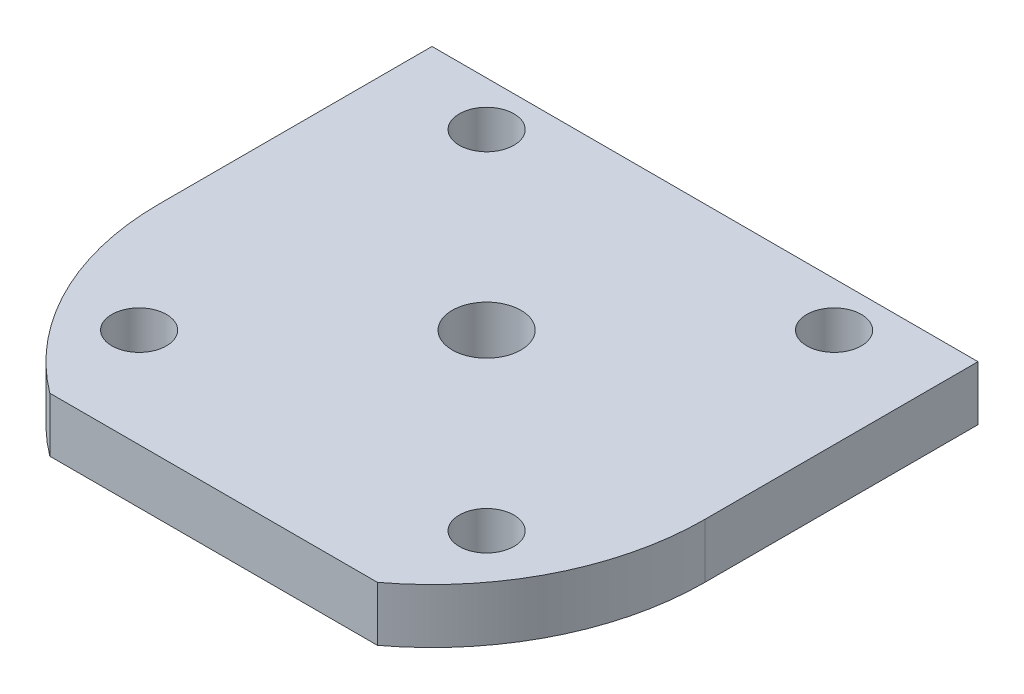
ISO-10303-21;
HEADER;
FILE_DESCRIPTION(('STEP AP214'),'2;1');
FILE_NAME('part.step','',(''),(''),'','','');
FILE_SCHEMA(('AUTOMOTIVE_DESIGN { 1 0 10303 214 1 1 1 1 }'));
ENDSEC;
DATA;
#1=APPLICATION_CONTEXT('core data for automotive mechanical design processes');
#2=APPLICATION_PROTOCOL_DEFINITION('international standard','automotive_design',2000,#1);
#3=PRODUCT_CONTEXT('',#1,'mechanical');
#4=PRODUCT('Part','Part','',(#3));
#5=PRODUCT_RELATED_PRODUCT_CATEGORY('part','',(#4));
#6=PRODUCT_DEFINITION_FORMATION('','',#4);
#7=PRODUCT_DEFINITION_CONTEXT('part definition',#1,'design');
#8=PRODUCT_DEFINITION('design','',#6,#7);
#9=PRODUCT_DEFINITION_SHAPE('','',#8);
#10=(LENGTH_UNIT() NAMED_UNIT(*) SI_UNIT(.MILLI.,.METRE.));
#11=(NAMED_UNIT(*) PLANE_ANGLE_UNIT() SI_UNIT($,.RADIAN.));
#12=(NAMED_UNIT(*) SI_UNIT($,.STERADIAN.) SOLID_ANGLE_UNIT());
#13=UNCERTAINTY_MEASURE_WITH_UNIT(LENGTH_MEASURE(1.E-05),#10,'distance_accuracy_value','');
#14=(GEOMETRIC_REPRESENTATION_CONTEXT(3) GLOBAL_UNCERTAINTY_ASSIGNED_CONTEXT((#13)) GLOBAL_UNIT_ASSIGNED_CONTEXT((#10,
#11,#12)) REPRESENTATION_CONTEXT('',''));
#15=CARTESIAN_POINT('',(0.,0.,0.));
#16=DIRECTION('',(0.,0.,1.));
#17=DIRECTION('',(1.,0.,0.));
#18=AXIS2_PLACEMENT_3D('',#15,#16,#17);
#19=CARTESIAN_POINT('',(0.,6.35,6.35000000000001));
#20=DIRECTION('',(0.,-1.,0.));
#21=DIRECTION('',(0.,0.,-1.));
#22=AXIS2_PLACEMENT_3D('',#19,#20,#21);
#23=CYLINDRICAL_SURFACE('',#22,31.75);
#24=CARTESIAN_POINT('',(0.,0.,6.35000000000001));
#25=DIRECTION('',(0.,1.,0.));
#26=DIRECTION('',(0.,0.,1.));
#27=AXIS2_PLACEMENT_3D('',#24,#25,#26);
#28=CIRCLE('',#27,31.75);
#29=CARTESIAN_POINT('',(-19.05,0.,31.75));
#30=VERTEX_POINT('',#29);
#31=CARTESIAN_POINT('',(-31.75,0.,6.35000000000002));
#32=VERTEX_POINT('',#31);
#33=EDGE_CURVE('E133',#30,#32,#28,.F.);
#34=ORIENTED_EDGE('',*,*,#33,.F.);
#35=DIRECTION('',(0.,-1.,0.));
#36=VECTOR('',#35,1.);
#37=CARTESIAN_POINT('',(-19.05,6.35,31.75));
#38=LINE('',#37,#36);
#39=CARTESIAN_POINT('',(-19.05,6.35,31.75));
#40=VERTEX_POINT('',#39);
#41=EDGE_CURVE('E11',#40,#30,#38,.T.);
#42=ORIENTED_EDGE('',*,*,#41,.F.);
#43=CARTESIAN_POINT('',(0.,6.35,6.35000000000001));
#44=DIRECTION('',(0.,1.,0.));
#45=DIRECTION('',(0.,0.,1.));
#46=AXIS2_PLACEMENT_3D('',#43,#44,#45);
#47=CIRCLE('',#46,31.75);
#48=CARTESIAN_POINT('',(-31.75,6.35,6.35000000000002));
#49=VERTEX_POINT('',#48);
#50=EDGE_CURVE('E311',#40,#49,#47,.F.);
#51=ORIENTED_EDGE('',*,*,#50,.T.);
#52=DIRECTION('',(0.,-1.,0.));
#53=VECTOR('',#52,1.);
#54=CARTESIAN_POINT('',(-31.75,6.35,6.35000000000002));
#55=LINE('',#54,#53);
#56=EDGE_CURVE('E52',#49,#32,#55,.T.);
#57=ORIENTED_EDGE('',*,*,#56,.T.);
#58=EDGE_LOOP('',(#34,#42,#51,#57));
#59=FACE_BOUND('',#58,.T.);
#60=ADVANCED_FACE('F35',(#59),#23,.T.);
#61=CARTESIAN_POINT('',(0.,6.35,31.75));
#62=DIRECTION('',(0.,0.,-1.));
#63=DIRECTION('',(-1.,0.,0.));
#64=AXIS2_PLACEMENT_3D('',#61,#62,#63);
#65=PLANE('',#64);
#66=DIRECTION('',(1.,0.,0.));
#67=VECTOR('',#66,1.);
#68=CARTESIAN_POINT('',(0.,0.,31.75));
#69=LINE('',#68,#67);
#70=CARTESIAN_POINT('',(19.05,0.,31.75));
#71=VERTEX_POINT('',#70);
#72=EDGE_CURVE('E135',#30,#71,#69,.T.);
#73=ORIENTED_EDGE('',*,*,#72,.T.);
#74=DIRECTION('',(0.,-1.,0.));
#75=VECTOR('',#74,1.);
#76=CARTESIAN_POINT('',(19.05,6.35,31.75));
#77=LINE('',#76,#75);
#78=CARTESIAN_POINT('',(19.05,6.35,31.75));
#79=VERTEX_POINT('',#78);
#80=EDGE_CURVE('E44',#79,#71,#77,.T.);
#81=ORIENTED_EDGE('',*,*,#80,.F.);
#82=DIRECTION('',(1.,0.,0.));
#83=VECTOR('',#82,1.);
#84=CARTESIAN_POINT('',(0.,6.35,31.75));
#85=LINE('',#84,#83);
#86=EDGE_CURVE('E313',#40,#79,#85,.T.);
#87=ORIENTED_EDGE('',*,*,#86,.F.);
#88=ORIENTED_EDGE('',*,*,#41,.T.);
#89=EDGE_LOOP('',(#73,#81,#87,#88));
#90=FACE_BOUND('',#89,.T.);
#91=ADVANCED_FACE('F159',(#90),#65,.F.);
#92=CARTESIAN_POINT('',(0.,6.35,6.35000000000001));
#93=DIRECTION('',(0.,-1.,0.));
#94=DIRECTION('',(0.,0.,-1.));
#95=AXIS2_PLACEMENT_3D('',#92,#93,#94);
#96=CYLINDRICAL_SURFACE('',#95,31.75);
#97=CARTESIAN_POINT('',(0.,0.,6.35000000000001));
#98=DIRECTION('',(0.,1.,0.));
#99=DIRECTION('',(0.,0.,1.));
#100=AXIS2_PLACEMENT_3D('',#97,#98,#99);
#101=CIRCLE('',#100,31.75);
#102=CARTESIAN_POINT('',(31.75,0.,6.35000000000002));
#103=VERTEX_POINT('',#102);
#104=EDGE_CURVE('E138',#103,#71,#101,.F.);
#105=ORIENTED_EDGE('',*,*,#104,.F.);
#106=DIRECTION('',(0.,-1.,0.));
#107=VECTOR('',#106,1.);
#108=CARTESIAN_POINT('',(31.75,6.35,6.35000000000002));
#109=LINE('',#108,#107);
#110=CARTESIAN_POINT('',(31.75,6.35,6.35000000000002));
#111=VERTEX_POINT('',#110);
#112=EDGE_CURVE('E110',#111,#103,#109,.T.);
#113=ORIENTED_EDGE('',*,*,#112,.F.);
#114=CARTESIAN_POINT('',(0.,6.35,6.35000000000001));
#115=DIRECTION('',(0.,1.,0.));
#116=DIRECTION('',(0.,0.,1.));
#117=AXIS2_PLACEMENT_3D('',#114,#115,#116);
#118=CIRCLE('',#117,31.75);
#119=EDGE_CURVE('E100',#111,#79,#118,.F.);
#120=ORIENTED_EDGE('',*,*,#119,.T.);
#121=ORIENTED_EDGE('',*,*,#80,.T.);
#122=EDGE_LOOP('',(#105,#113,#120,#121));
#123=FACE_BOUND('',#122,.T.);
#124=ADVANCED_FACE('F156',(#123),#96,.T.);
#125=CARTESIAN_POINT('',(31.75,6.35,0.));
#126=DIRECTION('',(-1.,0.,0.));
#127=DIRECTION('',(0.,0.,1.));
#128=AXIS2_PLACEMENT_3D('',#125,#126,#127);
#129=PLANE('',#128);
#130=DIRECTION('',(0.,0.,-1.));
#131=VECTOR('',#130,1.);
#132=CARTESIAN_POINT('',(31.75,0.,0.));
#133=LINE('',#132,#131);
#134=CARTESIAN_POINT('',(31.75,0.,-25.4));
#135=VERTEX_POINT('',#134);
#136=EDGE_CURVE('E107',#103,#135,#133,.T.);
#137=ORIENTED_EDGE('',*,*,#136,.T.);
#138=DIRECTION('',(0.,-1.,0.));
#139=VECTOR('',#138,1.);
#140=CARTESIAN_POINT('',(31.75,6.35,-25.4));
#141=LINE('',#140,#139);
#142=CARTESIAN_POINT('',(31.75,6.35,-25.4));
#143=VERTEX_POINT('',#142);
#144=EDGE_CURVE('E104',#143,#135,#141,.T.);
#145=ORIENTED_EDGE('',*,*,#144,.F.);
#146=DIRECTION('',(0.,0.,-1.));
#147=VECTOR('',#146,1.);
#148=CARTESIAN_POINT('',(31.75,6.35,0.));
#149=LINE('',#148,#147);
#150=EDGE_CURVE('E91',#111,#143,#149,.T.);
#151=ORIENTED_EDGE('',*,*,#150,.F.);
#152=ORIENTED_EDGE('',*,*,#112,.T.);
#153=EDGE_LOOP('',(#137,#145,#151,#152));
#154=FACE_BOUND('',#153,.T.);
#155=ADVANCED_FACE('F105',(#154),#129,.F.);
#156=CARTESIAN_POINT('',(0.,6.35,-25.4));
#157=DIRECTION('',(0.,0.,-1.));
#158=DIRECTION('',(-1.,0.,0.));
#159=AXIS2_PLACEMENT_3D('',#156,#157,#158);
#160=PLANE('',#159);
#161=DIRECTION('',(1.,0.,0.));
#162=VECTOR('',#161,1.);
#163=CARTESIAN_POINT('',(0.,0.,-25.4));
#164=LINE('',#163,#162);
#165=CARTESIAN_POINT('',(-31.75,0.,-25.4));
#166=VERTEX_POINT('',#165);
#167=EDGE_CURVE('E142',#166,#135,#164,.T.);
#168=ORIENTED_EDGE('',*,*,#167,.F.);
#169=DIRECTION('',(0.,-1.,0.));
#170=VECTOR('',#169,1.);
#171=CARTESIAN_POINT('',(-31.75,6.35,-25.4));
#172=LINE('',#171,#170);
#173=CARTESIAN_POINT('',(-31.75,6.35,-25.4));
#174=VERTEX_POINT('',#173);
#175=EDGE_CURVE('E71',#174,#166,#172,.T.);
#176=ORIENTED_EDGE('',*,*,#175,.F.);
#177=DIRECTION('',(1.,0.,0.));
#178=VECTOR('',#177,1.);
#179=CARTESIAN_POINT('',(0.,6.35,-25.4));
#180=LINE('',#179,#178);
#181=EDGE_CURVE('E98',#174,#143,#180,.T.);
#182=ORIENTED_EDGE('',*,*,#181,.T.);
#183=ORIENTED_EDGE('',*,*,#144,.T.);
#184=EDGE_LOOP('',(#168,#176,#182,#183));
#185=FACE_BOUND('',#184,.T.);
#186=ADVANCED_FACE('F112',(#185),#160,.T.);
#187=CARTESIAN_POINT('',(-31.75,6.35,0.));
#188=DIRECTION('',(-1.,0.,0.));
#189=DIRECTION('',(0.,0.,1.));
#190=AXIS2_PLACEMENT_3D('',#187,#188,#189);
#191=PLANE('',#190);
#192=DIRECTION('',(0.,0.,-1.));
#193=VECTOR('',#192,1.);
#194=CARTESIAN_POINT('',(-31.75,0.,0.));
#195=LINE('',#194,#193);
#196=EDGE_CURVE('E144',#32,#166,#195,.T.);
#197=ORIENTED_EDGE('',*,*,#196,.F.);
#198=ORIENTED_EDGE('',*,*,#56,.F.);
#199=DIRECTION('',(0.,0.,-1.));
#200=VECTOR('',#199,1.);
#201=CARTESIAN_POINT('',(-31.75,6.35,0.));
#202=LINE('',#201,#200);
#203=EDGE_CURVE('E113',#49,#174,#202,.T.);
#204=ORIENTED_EDGE('',*,*,#203,.T.);
#205=ORIENTED_EDGE('',*,*,#175,.T.);
#206=EDGE_LOOP('',(#197,#198,#204,#205));
#207=FACE_BOUND('',#206,.T.);
#208=ADVANCED_FACE('F163',(#207),#191,.T.);
#209=CARTESIAN_POINT('',(20.2055762724056,6.35,-20.2055762724056));
#210=DIRECTION('',(0.,-1.,0.));
#211=DIRECTION('',(0.,0.,-1.));
#212=AXIS2_PLACEMENT_3D('',#209,#210,#211);
#213=CYLINDRICAL_SURFACE('',#212,3.17500000000005);
#214=CARTESIAN_POINT('',(20.2055762724056,6.35,-20.2055762724056));
#215=DIRECTION('',(0.,1.,0.));
#216=DIRECTION('',(0.,0.,1.));
#217=AXIS2_PLACEMENT_3D('',#214,#215,#216);
#218=CIRCLE('',#217,3.17500000000005);
#219=CARTESIAN_POINT('',(20.2055762724056,6.35,-17.0305762724055));
#220=VERTEX_POINT('',#219);
#221=EDGE_CURVE('E310',#220,#220,#218,.T.);
#222=ORIENTED_EDGE('',*,*,#221,.T.);
#223=EDGE_LOOP('',(#222));
#224=FACE_BOUND('',#223,.T.);
#225=CARTESIAN_POINT('',(20.2055762724056,0.,-20.2055762724056));
#226=DIRECTION('',(0.,1.,0.));
#227=DIRECTION('',(0.,0.,1.));
#228=AXIS2_PLACEMENT_3D('',#225,#226,#227);
#229=CIRCLE('',#228,3.17500000000005);
#230=CARTESIAN_POINT('',(20.2055762724056,0.,-17.0305762724055));
#231=VERTEX_POINT('',#230);
#232=EDGE_CURVE('E130',#231,#231,#229,.T.);
#233=ORIENTED_EDGE('',*,*,#232,.F.);
#234=EDGE_LOOP('',(#233));
#235=FACE_BOUND('',#234,.T.);
#236=ADVANCED_FACE('F165',(#224,#235),#213,.F.);
#237=CARTESIAN_POINT('',(20.2055762724056,6.35,20.2055762724056));
#238=DIRECTION('',(0.,-1.,0.));
#239=DIRECTION('',(0.,0.,-1.));
#240=AXIS2_PLACEMENT_3D('',#237,#238,#239);
#241=CYLINDRICAL_SURFACE('',#240,3.17500000000015);
#242=CARTESIAN_POINT('',(20.2055762724056,6.35,20.2055762724056));
#243=DIRECTION('',(0.,1.,0.));
#244=DIRECTION('',(0.,0.,1.));
#245=AXIS2_PLACEMENT_3D('',#242,#243,#244);
#246=CIRCLE('',#245,3.17500000000015);
#247=CARTESIAN_POINT('',(20.2055762724056,6.35,23.3805762724057));
#248=VERTEX_POINT('',#247);
#249=EDGE_CURVE('E307',#248,#248,#246,.T.);
#250=ORIENTED_EDGE('',*,*,#249,.T.);
#251=EDGE_LOOP('',(#250));
#252=FACE_BOUND('',#251,.T.);
#253=CARTESIAN_POINT('',(20.2055762724056,0.,20.2055762724056));
#254=DIRECTION('',(0.,1.,0.));
#255=DIRECTION('',(0.,0.,1.));
#256=AXIS2_PLACEMENT_3D('',#253,#254,#255);
#257=CIRCLE('',#256,3.17500000000015);
#258=CARTESIAN_POINT('',(20.2055762724056,0.,23.3805762724057));
#259=VERTEX_POINT('',#258);
#260=EDGE_CURVE('E127',#259,#259,#257,.T.);
#261=ORIENTED_EDGE('',*,*,#260,.F.);
#262=EDGE_LOOP('',(#261));
#263=FACE_BOUND('',#262,.T.);
#264=ADVANCED_FACE('F171',(#252,#263),#241,.F.);
#265=CARTESIAN_POINT('',(-20.2055762724056,6.35,20.2055762724056));
#266=DIRECTION('',(0.,-1.,0.));
#267=DIRECTION('',(0.,0.,-1.));
#268=AXIS2_PLACEMENT_3D('',#265,#266,#267);
#269=CYLINDRICAL_SURFACE('',#268,3.17500000000024);
#270=CARTESIAN_POINT('',(-20.2055762724056,6.35,20.2055762724056));
#271=DIRECTION('',(0.,1.,0.));
#272=DIRECTION('',(0.,0.,1.));
#273=AXIS2_PLACEMENT_3D('',#270,#271,#272);
#274=CIRCLE('',#273,3.17500000000024);
#275=CARTESIAN_POINT('',(-20.2055762724056,6.35,23.3805762724058));
#276=VERTEX_POINT('',#275);
#277=EDGE_CURVE('E197',#276,#276,#274,.T.);
#278=ORIENTED_EDGE('',*,*,#277,.T.);
#279=EDGE_LOOP('',(#278));
#280=FACE_BOUND('',#279,.T.);
#281=CARTESIAN_POINT('',(-20.2055762724056,0.,20.2055762724056));
#282=DIRECTION('',(0.,1.,0.));
#283=DIRECTION('',(0.,0.,1.));
#284=AXIS2_PLACEMENT_3D('',#281,#282,#283);
#285=CIRCLE('',#284,3.17500000000024);
#286=CARTESIAN_POINT('',(-20.2055762724056,0.,23.3805762724058));
#287=VERTEX_POINT('',#286);
#288=EDGE_CURVE('E124',#287,#287,#285,.T.);
#289=ORIENTED_EDGE('',*,*,#288,.F.);
#290=EDGE_LOOP('',(#289));
#291=FACE_BOUND('',#290,.T.);
#292=ADVANCED_FACE('F185',(#280,#291),#269,.F.);
#293=CARTESIAN_POINT('',(-20.2055762724056,6.35,-20.2055762724056));
#294=DIRECTION('',(0.,-1.,0.));
#295=DIRECTION('',(0.,0.,-1.));
#296=AXIS2_PLACEMENT_3D('',#293,#294,#295);
#297=CYLINDRICAL_SURFACE('',#296,3.17500000000034);
#298=CARTESIAN_POINT('',(-20.2055762724056,6.35,-20.2055762724056));
#299=DIRECTION('',(0.,1.,0.));
#300=DIRECTION('',(0.,0.,1.));
#301=AXIS2_PLACEMENT_3D('',#298,#299,#300);
#302=CIRCLE('',#301,3.17500000000034);
#303=CARTESIAN_POINT('',(-20.2055762724056,6.35,-17.0305762724053));
#304=VERTEX_POINT('',#303);
#305=EDGE_CURVE('E150',#304,#304,#302,.T.);
#306=ORIENTED_EDGE('',*,*,#305,.T.);
#307=EDGE_LOOP('',(#306));
#308=FACE_BOUND('',#307,.T.);
#309=CARTESIAN_POINT('',(-20.2055762724056,0.,-20.2055762724056));
#310=DIRECTION('',(0.,1.,0.));
#311=DIRECTION('',(0.,0.,1.));
#312=AXIS2_PLACEMENT_3D('',#309,#310,#311);
#313=CIRCLE('',#312,3.17500000000034);
#314=CARTESIAN_POINT('',(-20.2055762724056,0.,-17.0305762724053));
#315=VERTEX_POINT('',#314);
#316=EDGE_CURVE('E121',#315,#315,#313,.T.);
#317=ORIENTED_EDGE('',*,*,#316,.F.);
#318=EDGE_LOOP('',(#317));
#319=FACE_BOUND('',#318,.T.);
#320=ADVANCED_FACE('F37',(#308,#319),#297,.F.);
#321=CARTESIAN_POINT('',(0.,6.35,0.));
#322=DIRECTION('',(0.,-1.,0.));
#323=DIRECTION('',(0.,0.,-1.));
#324=AXIS2_PLACEMENT_3D('',#321,#322,#323);
#325=CYLINDRICAL_SURFACE('',#324,4.);
#326=CARTESIAN_POINT('',(0.,6.35,0.));
#327=DIRECTION('',(0.,1.,0.));
#328=DIRECTION('',(0.,0.,1.));
#329=AXIS2_PLACEMENT_3D('',#326,#327,#328);
#330=CIRCLE('',#329,4.);
#331=CARTESIAN_POINT('',(0.,6.35,4.));
#332=VERTEX_POINT('',#331);
#333=EDGE_CURVE('E115',#332,#332,#330,.T.);
#334=ORIENTED_EDGE('',*,*,#333,.T.);
#335=EDGE_LOOP('',(#334));
#336=FACE_BOUND('',#335,.T.);
#337=CARTESIAN_POINT('',(0.,0.,0.));
#338=DIRECTION('',(0.,1.,0.));
#339=DIRECTION('',(0.,0.,1.));
#340=AXIS2_PLACEMENT_3D('',#337,#338,#339);
#341=CIRCLE('',#340,4.);
#342=CARTESIAN_POINT('',(0.,0.,4.));
#343=VERTEX_POINT('',#342);
#344=EDGE_CURVE('E147',#343,#343,#341,.T.);
#345=ORIENTED_EDGE('',*,*,#344,.F.);
#346=EDGE_LOOP('',(#345));
#347=FACE_BOUND('',#346,.T.);
#348=ADVANCED_FACE('F192',(#336,#347),#325,.F.);
#349=CARTESIAN_POINT('',(0.,6.35,0.));
#350=DIRECTION('',(0.,1.,0.));
#351=DIRECTION('',(0.,0.,1.));
#352=AXIS2_PLACEMENT_3D('',#349,#350,#351);
#353=PLANE('',#352);
#354=ORIENTED_EDGE('',*,*,#305,.F.);
#355=EDGE_LOOP('',(#354));
#356=FACE_BOUND('',#355,.T.);
#357=ORIENTED_EDGE('',*,*,#277,.F.);
#358=EDGE_LOOP('',(#357));
#359=FACE_BOUND('',#358,.T.);
#360=ORIENTED_EDGE('',*,*,#249,.F.);
#361=EDGE_LOOP('',(#360));
#362=FACE_BOUND('',#361,.T.);
#363=ORIENTED_EDGE('',*,*,#221,.F.);
#364=EDGE_LOOP('',(#363));
#365=FACE_BOUND('',#364,.T.);
#366=ORIENTED_EDGE('',*,*,#50,.F.);
#367=ORIENTED_EDGE('',*,*,#86,.T.);
#368=ORIENTED_EDGE('',*,*,#119,.F.);
#369=ORIENTED_EDGE('',*,*,#150,.T.);
#370=ORIENTED_EDGE('',*,*,#181,.F.);
#371=ORIENTED_EDGE('',*,*,#203,.F.);
#372=EDGE_LOOP('',(#366,#367,#368,#369,#370,#371));
#373=FACE_BOUND('',#372,.T.);
#374=ORIENTED_EDGE('',*,*,#333,.F.);
#375=EDGE_LOOP('',(#374));
#376=FACE_BOUND('',#375,.T.);
#377=ADVANCED_FACE('F94',(#356,#359,#362,#365,#373,#376),#353,.T.);
#378=CARTESIAN_POINT('',(0.,0.,0.));
#379=DIRECTION('',(0.,1.,0.));
#380=DIRECTION('',(0.,0.,1.));
#381=AXIS2_PLACEMENT_3D('',#378,#379,#380);
#382=PLANE('',#381);
#383=ORIENTED_EDGE('',*,*,#316,.T.);
#384=EDGE_LOOP('',(#383));
#385=FACE_BOUND('',#384,.T.);
#386=ORIENTED_EDGE('',*,*,#288,.T.);
#387=EDGE_LOOP('',(#386));
#388=FACE_BOUND('',#387,.T.);
#389=ORIENTED_EDGE('',*,*,#260,.T.);
#390=EDGE_LOOP('',(#389));
#391=FACE_BOUND('',#390,.T.);
#392=ORIENTED_EDGE('',*,*,#232,.T.);
#393=EDGE_LOOP('',(#392));
#394=FACE_BOUND('',#393,.T.);
#395=ORIENTED_EDGE('',*,*,#33,.T.);
#396=ORIENTED_EDGE('',*,*,#196,.T.);
#397=ORIENTED_EDGE('',*,*,#167,.T.);
#398=ORIENTED_EDGE('',*,*,#136,.F.);
#399=ORIENTED_EDGE('',*,*,#104,.T.);
#400=ORIENTED_EDGE('',*,*,#72,.F.);
#401=EDGE_LOOP('',(#395,#396,#397,#398,#399,#400));
#402=FACE_BOUND('',#401,.T.);
#403=ORIENTED_EDGE('',*,*,#344,.T.);
#404=EDGE_LOOP('',(#403));
#405=FACE_BOUND('',#404,.T.);
#406=ADVANCED_FACE('F161',(#385,#388,#391,#394,#402,#405),#382,.F.);
#407=CLOSED_SHELL('',(#60,#91,#124,#155,#186,#208,#236,#264,#292,#320,#348,#377,#406));
#408=MANIFOLD_SOLID_BREP('B2',#407);
#409=ADVANCED_BREP_SHAPE_REPRESENTATION('',(#18,#408),#14);
#410=SHAPE_DEFINITION_REPRESENTATION(#9,#409);
ENDSEC;
END-ISO-10303-21;
